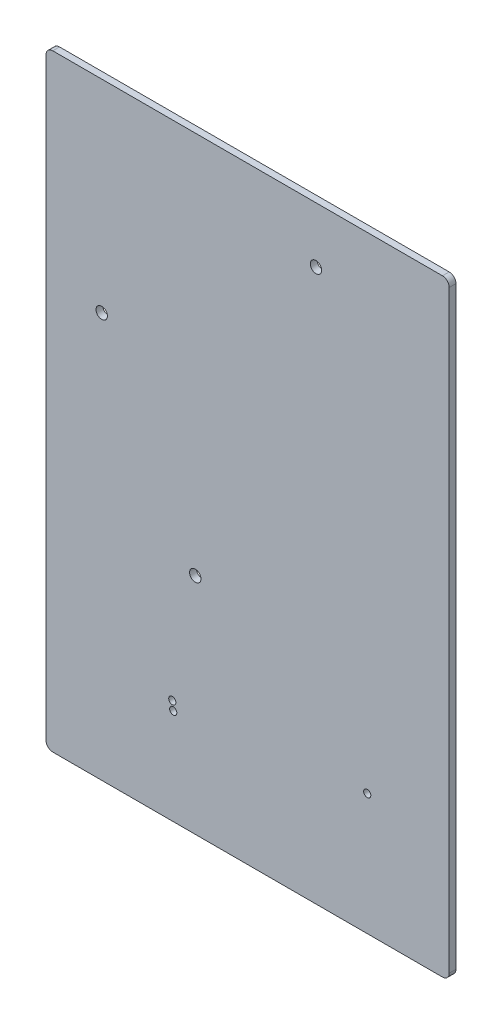
ISO-10303-21;
HEADER;
FILE_DESCRIPTION(('STEP AP214'),'2;1');
FILE_NAME('part.step','',(''),(''),'','','');
FILE_SCHEMA(('AUTOMOTIVE_DESIGN { 1 0 10303 214 1 1 1 1 }'));
ENDSEC;
DATA;
#1=APPLICATION_CONTEXT('core data for automotive mechanical design processes');
#2=APPLICATION_PROTOCOL_DEFINITION('international standard','automotive_design',2000,#1);
#3=PRODUCT_CONTEXT('',#1,'mechanical');
#4=PRODUCT('Part','Part','',(#3));
#5=PRODUCT_RELATED_PRODUCT_CATEGORY('part','',(#4));
#6=PRODUCT_DEFINITION_FORMATION('','',#4);
#7=PRODUCT_DEFINITION_CONTEXT('part definition',#1,'design');
#8=PRODUCT_DEFINITION('design','',#6,#7);
#9=PRODUCT_DEFINITION_SHAPE('','',#8);
#10=(LENGTH_UNIT() NAMED_UNIT(*) SI_UNIT(.MILLI.,.METRE.));
#11=(NAMED_UNIT(*) PLANE_ANGLE_UNIT() SI_UNIT($,.RADIAN.));
#12=(NAMED_UNIT(*) SI_UNIT($,.STERADIAN.) SOLID_ANGLE_UNIT());
#13=UNCERTAINTY_MEASURE_WITH_UNIT(LENGTH_MEASURE(1.E-05),#10,'distance_accuracy_value','');
#14=(GEOMETRIC_REPRESENTATION_CONTEXT(3) GLOBAL_UNCERTAINTY_ASSIGNED_CONTEXT((#13)) GLOBAL_UNIT_ASSIGNED_CONTEXT((#10,
#11,#12)) REPRESENTATION_CONTEXT('',''));
#15=CARTESIAN_POINT('',(0.,0.,0.));
#16=DIRECTION('',(0.,0.,1.));
#17=DIRECTION('',(1.,0.,0.));
#18=AXIS2_PLACEMENT_3D('',#15,#16,#17);
#19=CARTESIAN_POINT('',(0.,0.,6.35));
#20=DIRECTION('',(0.,1.,0.));
#21=DIRECTION('',(0.,0.,1.));
#22=AXIS2_PLACEMENT_3D('',#19,#20,#21);
#23=PLANE('',#22);
#24=DIRECTION('',(1.,0.,0.));
#25=VECTOR('',#24,1.);
#26=CARTESIAN_POINT('',(0.,0.,0.));
#27=LINE('',#26,#25);
#28=CARTESIAN_POINT('',(6.35,0.,0.));
#29=VERTEX_POINT('',#28);
#30=CARTESIAN_POINT('',(373.0625,0.,0.));
#31=VERTEX_POINT('',#30);
#32=EDGE_CURVE('E165',#29,#31,#27,.T.);
#33=ORIENTED_EDGE('',*,*,#32,.T.);
#34=DIRECTION('',(0.,0.,-1.));
#35=VECTOR('',#34,1.);
#36=CARTESIAN_POINT('',(373.0625,0.,6.35));
#37=LINE('',#36,#35);
#38=CARTESIAN_POINT('',(373.0625,0.,6.35));
#39=VERTEX_POINT('',#38);
#40=EDGE_CURVE('E139',#31,#39,#37,.F.);
#41=ORIENTED_EDGE('',*,*,#40,.T.);
#42=DIRECTION('',(1.,0.,0.));
#43=VECTOR('',#42,1.);
#44=CARTESIAN_POINT('',(0.,0.,6.35));
#45=LINE('',#44,#43);
#46=CARTESIAN_POINT('',(6.35,0.,6.35));
#47=VERTEX_POINT('',#46);
#48=EDGE_CURVE('E107',#47,#39,#45,.T.);
#49=ORIENTED_EDGE('',*,*,#48,.F.);
#50=DIRECTION('',(0.,0.,-1.));
#51=VECTOR('',#50,1.);
#52=CARTESIAN_POINT('',(6.35,0.,6.35));
#53=LINE('',#52,#51);
#54=EDGE_CURVE('E136',#47,#29,#53,.T.);
#55=ORIENTED_EDGE('',*,*,#54,.T.);
#56=EDGE_LOOP('',(#33,#41,#49,#55));
#57=FACE_BOUND('',#56,.T.);
#58=ADVANCED_FACE('F34',(#57),#23,.F.);
#59=CARTESIAN_POINT('',(379.4125,571.5,6.35));
#60=DIRECTION('',(-1.,0.,0.));
#61=DIRECTION('',(0.,0.,1.));
#62=AXIS2_PLACEMENT_3D('',#59,#60,#61);
#63=PLANE('',#62);
#64=DIRECTION('',(0.,1.,0.));
#65=VECTOR('',#64,1.);
#66=CARTESIAN_POINT('',(379.4125,0.,6.35));
#67=LINE('',#66,#65);
#68=CARTESIAN_POINT('',(379.4125,6.34999999999997,6.35));
#69=VERTEX_POINT('',#68);
#70=CARTESIAN_POINT('',(379.4125,565.15,6.35));
#71=VERTEX_POINT('',#70);
#72=EDGE_CURVE('E104',#69,#71,#67,.T.);
#73=ORIENTED_EDGE('',*,*,#72,.F.);
#74=DIRECTION('',(0.,0.,-1.));
#75=VECTOR('',#74,1.);
#76=CARTESIAN_POINT('',(379.4125,6.34999999999997,6.35));
#77=LINE('',#76,#75);
#78=CARTESIAN_POINT('',(379.4125,6.34999999999997,0.));
#79=VERTEX_POINT('',#78);
#80=EDGE_CURVE('E116',#69,#79,#77,.T.);
#81=ORIENTED_EDGE('',*,*,#80,.T.);
#82=DIRECTION('',(0.,1.,0.));
#83=VECTOR('',#82,1.);
#84=CARTESIAN_POINT('',(379.4125,0.,0.));
#85=LINE('',#84,#83);
#86=CARTESIAN_POINT('',(379.4125,565.15,0.));
#87=VERTEX_POINT('',#86);
#88=EDGE_CURVE('E163',#79,#87,#85,.T.);
#89=ORIENTED_EDGE('',*,*,#88,.T.);
#90=DIRECTION('',(0.,0.,-1.));
#91=VECTOR('',#90,1.);
#92=CARTESIAN_POINT('',(379.4125,565.15,6.35));
#93=LINE('',#92,#91);
#94=EDGE_CURVE('E119',#87,#71,#93,.F.);
#95=ORIENTED_EDGE('',*,*,#94,.T.);
#96=EDGE_LOOP('',(#73,#81,#89,#95));
#97=FACE_BOUND('',#96,.T.);
#98=ADVANCED_FACE('F114',(#97),#63,.F.);
#99=CARTESIAN_POINT('',(379.4125,571.5,6.35));
#100=DIRECTION('',(0.,-1.,0.));
#101=DIRECTION('',(0.,0.,-1.));
#102=AXIS2_PLACEMENT_3D('',#99,#100,#101);
#103=PLANE('',#102);
#104=DIRECTION('',(-1.,0.,0.));
#105=VECTOR('',#104,1.);
#106=CARTESIAN_POINT('',(379.4125,571.5,0.));
#107=LINE('',#106,#105);
#108=CARTESIAN_POINT('',(373.0625,571.5,0.));
#109=VERTEX_POINT('',#108);
#110=CARTESIAN_POINT('',(6.35000000000002,571.5,0.));
#111=VERTEX_POINT('',#110);
#112=EDGE_CURVE('E156',#109,#111,#107,.T.);
#113=ORIENTED_EDGE('',*,*,#112,.T.);
#114=DIRECTION('',(0.,0.,-1.));
#115=VECTOR('',#114,1.);
#116=CARTESIAN_POINT('',(6.35000000000002,571.5,6.35));
#117=LINE('',#116,#115);
#118=CARTESIAN_POINT('',(6.35000000000002,571.5,6.35));
#119=VERTEX_POINT('',#118);
#120=EDGE_CURVE('E11',#111,#119,#117,.F.);
#121=ORIENTED_EDGE('',*,*,#120,.T.);
#122=DIRECTION('',(-1.,0.,0.));
#123=VECTOR('',#122,1.);
#124=CARTESIAN_POINT('',(379.4125,571.5,6.35));
#125=LINE('',#124,#123);
#126=CARTESIAN_POINT('',(373.0625,571.5,6.35));
#127=VERTEX_POINT('',#126);
#128=EDGE_CURVE('E120',#127,#119,#125,.T.);
#129=ORIENTED_EDGE('',*,*,#128,.F.);
#130=DIRECTION('',(0.,0.,-1.));
#131=VECTOR('',#130,1.);
#132=CARTESIAN_POINT('',(373.0625,571.5,6.35));
#133=LINE('',#132,#131);
#134=EDGE_CURVE('E42',#127,#109,#133,.T.);
#135=ORIENTED_EDGE('',*,*,#134,.T.);
#136=EDGE_LOOP('',(#113,#121,#129,#135));
#137=FACE_BOUND('',#136,.T.);
#138=ADVANCED_FACE('F155',(#137),#103,.F.);
#139=CARTESIAN_POINT('',(0.,0.,6.35));
#140=DIRECTION('',(1.,0.,0.));
#141=DIRECTION('',(0.,0.,-1.));
#142=AXIS2_PLACEMENT_3D('',#139,#140,#141);
#143=PLANE('',#142);
#144=DIRECTION('',(0.,-1.,0.));
#145=VECTOR('',#144,1.);
#146=CARTESIAN_POINT('',(0.,0.,6.35));
#147=LINE('',#146,#145);
#148=CARTESIAN_POINT('',(0.,565.15,6.35));
#149=VERTEX_POINT('',#148);
#150=CARTESIAN_POINT('',(0.,6.35,6.35));
#151=VERTEX_POINT('',#150);
#152=EDGE_CURVE('E128',#149,#151,#147,.T.);
#153=ORIENTED_EDGE('',*,*,#152,.F.);
#154=DIRECTION('',(0.,0.,-1.));
#155=VECTOR('',#154,1.);
#156=CARTESIAN_POINT('',(0.,565.15,6.35));
#157=LINE('',#156,#155);
#158=CARTESIAN_POINT('',(0.,565.15,0.));
#159=VERTEX_POINT('',#158);
#160=EDGE_CURVE('E147',#149,#159,#157,.T.);
#161=ORIENTED_EDGE('',*,*,#160,.T.);
#162=DIRECTION('',(0.,-1.,0.));
#163=VECTOR('',#162,1.);
#164=CARTESIAN_POINT('',(0.,0.,0.));
#165=LINE('',#164,#163);
#166=CARTESIAN_POINT('',(0.,6.35,0.));
#167=VERTEX_POINT('',#166);
#168=EDGE_CURVE('E162',#159,#167,#165,.T.);
#169=ORIENTED_EDGE('',*,*,#168,.T.);
#170=DIRECTION('',(0.,0.,-1.));
#171=VECTOR('',#170,1.);
#172=CARTESIAN_POINT('',(0.,6.35,6.35));
#173=LINE('',#172,#171);
#174=EDGE_CURVE('E49',#167,#151,#173,.F.);
#175=ORIENTED_EDGE('',*,*,#174,.T.);
#176=EDGE_LOOP('',(#153,#161,#169,#175));
#177=FACE_BOUND('',#176,.T.);
#178=ADVANCED_FACE('F259',(#177),#143,.F.);
#179=CARTESIAN_POINT('',(0.,0.,6.35));
#180=DIRECTION('',(0.,0.,1.));
#181=DIRECTION('',(1.,0.,0.));
#182=AXIS2_PLACEMENT_3D('',#179,#180,#181);
#183=PLANE('',#182);
#184=CARTESIAN_POINT('',(254.,519.1125,6.35));
#185=DIRECTION('',(0.,0.,-1.));
#186=DIRECTION('',(-1.,0.,0.));
#187=AXIS2_PLACEMENT_3D('',#184,#185,#186);
#188=CIRCLE('',#187,5.35787599999998);
#189=CARTESIAN_POINT('',(248.642124,519.1125,6.35));
#190=VERTEX_POINT('',#189);
#191=EDGE_CURVE('E203',#190,#190,#188,.T.);
#192=ORIENTED_EDGE('',*,*,#191,.T.);
#193=EDGE_LOOP('',(#192));
#194=FACE_BOUND('',#193,.T.);
#195=CARTESIAN_POINT('',(52.3875,381.,6.35));
#196=DIRECTION('',(0.,0.,-1.));
#197=DIRECTION('',(-1.,0.,0.));
#198=AXIS2_PLACEMENT_3D('',#195,#196,#197);
#199=CIRCLE('',#198,5.357876);
#200=CARTESIAN_POINT('',(47.029624,381.,6.35));
#201=VERTEX_POINT('',#200);
#202=EDGE_CURVE('E197',#201,#201,#199,.T.);
#203=ORIENTED_EDGE('',*,*,#202,.T.);
#204=EDGE_LOOP('',(#203));
#205=FACE_BOUND('',#204,.T.);
#206=CARTESIAN_POINT('',(140.462,210.82,6.35));
#207=DIRECTION('',(0.,0.,-1.));
#208=DIRECTION('',(-1.,0.,0.));
#209=AXIS2_PLACEMENT_3D('',#206,#207,#208);
#210=CIRCLE('',#209,5.35787600000001);
#211=CARTESIAN_POINT('',(135.104124,210.82,6.35));
#212=VERTEX_POINT('',#211);
#213=EDGE_CURVE('E191',#212,#212,#210,.T.);
#214=ORIENTED_EDGE('',*,*,#213,.T.);
#215=EDGE_LOOP('',(#214));
#216=FACE_BOUND('',#215,.T.);
#217=ORIENTED_EDGE('',*,*,#48,.T.);
#218=CARTESIAN_POINT('',(373.0625,6.34999999999997,6.35));
#219=DIRECTION('',(0.,0.,1.));
#220=DIRECTION('',(1.,0.,0.));
#221=AXIS2_PLACEMENT_3D('',#218,#219,#220);
#222=CIRCLE('',#221,6.35);
#223=EDGE_CURVE('E100',#39,#69,#222,.T.);
#224=ORIENTED_EDGE('',*,*,#223,.T.);
#225=ORIENTED_EDGE('',*,*,#72,.T.);
#226=CARTESIAN_POINT('',(373.0625,565.15,6.35));
#227=DIRECTION('',(0.,0.,1.));
#228=DIRECTION('',(1.,0.,0.));
#229=AXIS2_PLACEMENT_3D('',#226,#227,#228);
#230=CIRCLE('',#229,6.35);
#231=EDGE_CURVE('E143',#71,#127,#230,.T.);
#232=ORIENTED_EDGE('',*,*,#231,.T.);
#233=ORIENTED_EDGE('',*,*,#128,.T.);
#234=CARTESIAN_POINT('',(6.35,565.15,6.35));
#235=DIRECTION('',(0.,0.,1.));
#236=DIRECTION('',(1.,0.,0.));
#237=AXIS2_PLACEMENT_3D('',#234,#235,#236);
#238=CIRCLE('',#237,6.35);
#239=EDGE_CURVE('E56',#119,#149,#238,.T.);
#240=ORIENTED_EDGE('',*,*,#239,.T.);
#241=ORIENTED_EDGE('',*,*,#152,.T.);
#242=CARTESIAN_POINT('',(6.35,6.35,6.35));
#243=DIRECTION('',(0.,0.,1.));
#244=DIRECTION('',(1.,0.,0.));
#245=AXIS2_PLACEMENT_3D('',#242,#243,#244);
#246=CIRCLE('',#245,6.35);
#247=EDGE_CURVE('E141',#151,#47,#246,.T.);
#248=ORIENTED_EDGE('',*,*,#247,.T.);
#249=EDGE_LOOP('',(#217,#224,#225,#232,#233,#240,#241,#248));
#250=FACE_BOUND('',#249,.T.);
#251=CARTESIAN_POINT('',(118.810746346405,98.25026997302,6.35));
#252=DIRECTION('',(0.,0.,-1.));
#253=DIRECTION('',(-1.,0.,0.));
#254=AXIS2_PLACEMENT_3D('',#251,#252,#253);
#255=CIRCLE('',#254,3.3782);
#256=CARTESIAN_POINT('',(115.432546346405,98.25026997302,6.35));
#257=VERTEX_POINT('',#256);
#258=EDGE_CURVE('E185',#257,#257,#255,.T.);
#259=ORIENTED_EDGE('',*,*,#258,.T.);
#260=EDGE_LOOP('',(#259));
#261=FACE_BOUND('',#260,.T.);
#262=CARTESIAN_POINT('',(302.26,114.3,6.35));
#263=DIRECTION('',(0.,0.,-1.));
#264=DIRECTION('',(-1.,0.,0.));
#265=AXIS2_PLACEMENT_3D('',#262,#263,#264);
#266=CIRCLE('',#265,3.3782);
#267=CARTESIAN_POINT('',(298.8818,114.3,6.35));
#268=VERTEX_POINT('',#267);
#269=EDGE_CURVE('E179',#268,#268,#266,.T.);
#270=ORIENTED_EDGE('',*,*,#269,.T.);
#271=EDGE_LOOP('',(#270));
#272=FACE_BOUND('',#271,.T.);
#273=CARTESIAN_POINT('',(119.685428778013,90.2636017026774,6.35));
#274=DIRECTION('',(0.,0.,-1.));
#275=DIRECTION('',(-1.,0.,0.));
#276=AXIS2_PLACEMENT_3D('',#273,#274,#275);
#277=CIRCLE('',#276,3.3782);
#278=CARTESIAN_POINT('',(116.307228778013,90.2636017026774,6.35));
#279=VERTEX_POINT('',#278);
#280=EDGE_CURVE('E170',#279,#279,#277,.T.);
#281=ORIENTED_EDGE('',*,*,#280,.T.);
#282=EDGE_LOOP('',(#281));
#283=FACE_BOUND('',#282,.T.);
#284=ADVANCED_FACE('F102',(#194,#205,#216,#250,#261,#272,#283),#183,.T.);
#285=CARTESIAN_POINT('',(0.,0.,0.));
#286=DIRECTION('',(0.,0.,1.));
#287=DIRECTION('',(1.,0.,0.));
#288=AXIS2_PLACEMENT_3D('',#285,#286,#287);
#289=PLANE('',#288);
#290=CARTESIAN_POINT('',(254.,519.1125,0.));
#291=DIRECTION('',(0.,0.,-1.));
#292=DIRECTION('',(-1.,0.,0.));
#293=AXIS2_PLACEMENT_3D('',#290,#291,#292);
#294=CIRCLE('',#293,5.35787599999998);
#295=CARTESIAN_POINT('',(248.642124,519.1125,0.));
#296=VERTEX_POINT('',#295);
#297=EDGE_CURVE('E206',#296,#296,#294,.T.);
#298=ORIENTED_EDGE('',*,*,#297,.F.);
#299=EDGE_LOOP('',(#298));
#300=FACE_BOUND('',#299,.T.);
#301=CARTESIAN_POINT('',(52.3875,381.,0.));
#302=DIRECTION('',(0.,0.,-1.));
#303=DIRECTION('',(-1.,0.,0.));
#304=AXIS2_PLACEMENT_3D('',#301,#302,#303);
#305=CIRCLE('',#304,5.357876);
#306=CARTESIAN_POINT('',(47.029624,381.,0.));
#307=VERTEX_POINT('',#306);
#308=EDGE_CURVE('E200',#307,#307,#305,.T.);
#309=ORIENTED_EDGE('',*,*,#308,.F.);
#310=EDGE_LOOP('',(#309));
#311=FACE_BOUND('',#310,.T.);
#312=CARTESIAN_POINT('',(140.462,210.82,0.));
#313=DIRECTION('',(0.,0.,-1.));
#314=DIRECTION('',(-1.,0.,0.));
#315=AXIS2_PLACEMENT_3D('',#312,#313,#314);
#316=CIRCLE('',#315,5.35787600000001);
#317=CARTESIAN_POINT('',(135.104124,210.82,0.));
#318=VERTEX_POINT('',#317);
#319=EDGE_CURVE('E194',#318,#318,#316,.T.);
#320=ORIENTED_EDGE('',*,*,#319,.F.);
#321=EDGE_LOOP('',(#320));
#322=FACE_BOUND('',#321,.T.);
#323=CARTESIAN_POINT('',(118.810746346405,98.25026997302,0.));
#324=DIRECTION('',(0.,0.,-1.));
#325=DIRECTION('',(-1.,0.,0.));
#326=AXIS2_PLACEMENT_3D('',#323,#324,#325);
#327=CIRCLE('',#326,3.37819999999998);
#328=CARTESIAN_POINT('',(115.432546346405,98.25026997302,0.));
#329=VERTEX_POINT('',#328);
#330=EDGE_CURVE('E188',#329,#329,#327,.T.);
#331=ORIENTED_EDGE('',*,*,#330,.F.);
#332=EDGE_LOOP('',(#331));
#333=FACE_BOUND('',#332,.T.);
#334=CARTESIAN_POINT('',(302.26,114.3,0.));
#335=DIRECTION('',(0.,0.,-1.));
#336=DIRECTION('',(-1.,0.,0.));
#337=AXIS2_PLACEMENT_3D('',#334,#335,#336);
#338=CIRCLE('',#337,3.3782);
#339=CARTESIAN_POINT('',(298.8818,114.3,0.));
#340=VERTEX_POINT('',#339);
#341=EDGE_CURVE('E182',#340,#340,#338,.T.);
#342=ORIENTED_EDGE('',*,*,#341,.F.);
#343=EDGE_LOOP('',(#342));
#344=FACE_BOUND('',#343,.T.);
#345=CARTESIAN_POINT('',(119.685428778013,90.2636017026774,0.));
#346=DIRECTION('',(0.,0.,-1.));
#347=DIRECTION('',(-1.,0.,0.));
#348=AXIS2_PLACEMENT_3D('',#345,#346,#347);
#349=CIRCLE('',#348,3.37819999999998);
#350=CARTESIAN_POINT('',(116.307228778013,90.2636017026774,0.));
#351=VERTEX_POINT('',#350);
#352=EDGE_CURVE('E176',#351,#351,#349,.T.);
#353=ORIENTED_EDGE('',*,*,#352,.F.);
#354=EDGE_LOOP('',(#353));
#355=FACE_BOUND('',#354,.T.);
#356=ORIENTED_EDGE('',*,*,#88,.F.);
#357=CARTESIAN_POINT('',(373.0625,6.34999999999997,0.));
#358=DIRECTION('',(0.,0.,1.));
#359=DIRECTION('',(1.,0.,0.));
#360=AXIS2_PLACEMENT_3D('',#357,#358,#359);
#361=CIRCLE('',#360,6.35);
#362=EDGE_CURVE('E123',#79,#31,#361,.F.);
#363=ORIENTED_EDGE('',*,*,#362,.T.);
#364=ORIENTED_EDGE('',*,*,#32,.F.);
#365=CARTESIAN_POINT('',(6.35,6.35,0.));
#366=DIRECTION('',(0.,0.,1.));
#367=DIRECTION('',(1.,0.,0.));
#368=AXIS2_PLACEMENT_3D('',#365,#366,#367);
#369=CIRCLE('',#368,6.35);
#370=EDGE_CURVE('E124',#29,#167,#369,.F.);
#371=ORIENTED_EDGE('',*,*,#370,.T.);
#372=ORIENTED_EDGE('',*,*,#168,.F.);
#373=CARTESIAN_POINT('',(6.35,565.15,0.));
#374=DIRECTION('',(0.,0.,1.));
#375=DIRECTION('',(1.,0.,0.));
#376=AXIS2_PLACEMENT_3D('',#373,#374,#375);
#377=CIRCLE('',#376,6.35);
#378=EDGE_CURVE('E133',#159,#111,#377,.F.);
#379=ORIENTED_EDGE('',*,*,#378,.T.);
#380=ORIENTED_EDGE('',*,*,#112,.F.);
#381=CARTESIAN_POINT('',(373.0625,565.15,0.));
#382=DIRECTION('',(0.,0.,1.));
#383=DIRECTION('',(1.,0.,0.));
#384=AXIS2_PLACEMENT_3D('',#381,#382,#383);
#385=CIRCLE('',#384,6.35);
#386=EDGE_CURVE('E126',#109,#87,#385,.F.);
#387=ORIENTED_EDGE('',*,*,#386,.T.);
#388=EDGE_LOOP('',(#356,#363,#364,#371,#372,#379,#380,#387));
#389=FACE_BOUND('',#388,.T.);
#390=ADVANCED_FACE('F160',(#300,#311,#322,#333,#344,#355,#389),#289,.F.);
#391=CARTESIAN_POINT('',(119.685428778013,90.2636017026774,0.));
#392=DIRECTION('',(0.,0.,-1.));
#393=DIRECTION('',(-1.,0.,0.));
#394=AXIS2_PLACEMENT_3D('',#391,#392,#393);
#395=CYLINDRICAL_SURFACE('',#394,3.37819999999999);
#396=ORIENTED_EDGE('',*,*,#280,.F.);
#397=EDGE_LOOP('',(#396));
#398=FACE_BOUND('',#397,.T.);
#399=ORIENTED_EDGE('',*,*,#352,.T.);
#400=EDGE_LOOP('',(#399));
#401=FACE_BOUND('',#400,.T.);
#402=ADVANCED_FACE('F214',(#398,#401),#395,.F.);
#403=CARTESIAN_POINT('',(302.26,114.3,0.));
#404=DIRECTION('',(0.,0.,-1.));
#405=DIRECTION('',(-1.,0.,0.));
#406=AXIS2_PLACEMENT_3D('',#403,#404,#405);
#407=CYLINDRICAL_SURFACE('',#406,3.3782);
#408=ORIENTED_EDGE('',*,*,#269,.F.);
#409=EDGE_LOOP('',(#408));
#410=FACE_BOUND('',#409,.T.);
#411=ORIENTED_EDGE('',*,*,#341,.T.);
#412=EDGE_LOOP('',(#411));
#413=FACE_BOUND('',#412,.T.);
#414=ADVANCED_FACE('F227',(#410,#413),#407,.F.);
#415=CARTESIAN_POINT('',(118.810746346405,98.25026997302,0.));
#416=DIRECTION('',(0.,0.,-1.));
#417=DIRECTION('',(-1.,0.,0.));
#418=AXIS2_PLACEMENT_3D('',#415,#416,#417);
#419=CYLINDRICAL_SURFACE('',#418,3.37819999999999);
#420=ORIENTED_EDGE('',*,*,#258,.F.);
#421=EDGE_LOOP('',(#420));
#422=FACE_BOUND('',#421,.T.);
#423=ORIENTED_EDGE('',*,*,#330,.T.);
#424=EDGE_LOOP('',(#423));
#425=FACE_BOUND('',#424,.T.);
#426=ADVANCED_FACE('F233',(#422,#425),#419,.F.);
#427=CARTESIAN_POINT('',(140.462,210.82,0.));
#428=DIRECTION('',(0.,0.,-1.));
#429=DIRECTION('',(-1.,0.,0.));
#430=AXIS2_PLACEMENT_3D('',#427,#428,#429);
#431=CYLINDRICAL_SURFACE('',#430,5.35787600000001);
#432=ORIENTED_EDGE('',*,*,#213,.F.);
#433=EDGE_LOOP('',(#432));
#434=FACE_BOUND('',#433,.T.);
#435=ORIENTED_EDGE('',*,*,#319,.T.);
#436=EDGE_LOOP('',(#435));
#437=FACE_BOUND('',#436,.T.);
#438=ADVANCED_FACE('F303',(#434,#437),#431,.F.);
#439=CARTESIAN_POINT('',(52.3875,381.,0.));
#440=DIRECTION('',(0.,0.,-1.));
#441=DIRECTION('',(-1.,0.,0.));
#442=AXIS2_PLACEMENT_3D('',#439,#440,#441);
#443=CYLINDRICAL_SURFACE('',#442,5.357876);
#444=ORIENTED_EDGE('',*,*,#202,.F.);
#445=EDGE_LOOP('',(#444));
#446=FACE_BOUND('',#445,.T.);
#447=ORIENTED_EDGE('',*,*,#308,.T.);
#448=EDGE_LOOP('',(#447));
#449=FACE_BOUND('',#448,.T.);
#450=ADVANCED_FACE('F292',(#446,#449),#443,.F.);
#451=CARTESIAN_POINT('',(254.,519.1125,0.));
#452=DIRECTION('',(0.,0.,-1.));
#453=DIRECTION('',(-1.,0.,0.));
#454=AXIS2_PLACEMENT_3D('',#451,#452,#453);
#455=CYLINDRICAL_SURFACE('',#454,5.35787599999998);
#456=ORIENTED_EDGE('',*,*,#191,.F.);
#457=EDGE_LOOP('',(#456));
#458=FACE_BOUND('',#457,.T.);
#459=ORIENTED_EDGE('',*,*,#297,.T.);
#460=EDGE_LOOP('',(#459));
#461=FACE_BOUND('',#460,.T.);
#462=ADVANCED_FACE('F210',(#458,#461),#455,.F.);
#463=CARTESIAN_POINT('',(373.0625,6.34999999999997,6.35));
#464=DIRECTION('',(0.,0.,-1.));
#465=DIRECTION('',(-1.,0.,0.));
#466=AXIS2_PLACEMENT_3D('',#463,#464,#465);
#467=CYLINDRICAL_SURFACE('',#466,6.35);
#468=ORIENTED_EDGE('',*,*,#223,.F.);
#469=ORIENTED_EDGE('',*,*,#40,.F.);
#470=ORIENTED_EDGE('',*,*,#362,.F.);
#471=ORIENTED_EDGE('',*,*,#80,.F.);
#472=EDGE_LOOP('',(#468,#469,#470,#471));
#473=FACE_BOUND('',#472,.T.);
#474=ADVANCED_FACE('F122',(#473),#467,.T.);
#475=CARTESIAN_POINT('',(6.35,565.15,6.35));
#476=DIRECTION('',(0.,0.,-1.));
#477=DIRECTION('',(-1.,0.,0.));
#478=AXIS2_PLACEMENT_3D('',#475,#476,#477);
#479=CYLINDRICAL_SURFACE('',#478,6.35);
#480=ORIENTED_EDGE('',*,*,#239,.F.);
#481=ORIENTED_EDGE('',*,*,#120,.F.);
#482=ORIENTED_EDGE('',*,*,#378,.F.);
#483=ORIENTED_EDGE('',*,*,#160,.F.);
#484=EDGE_LOOP('',(#480,#481,#482,#483));
#485=FACE_BOUND('',#484,.T.);
#486=ADVANCED_FACE('F249',(#485),#479,.T.);
#487=CARTESIAN_POINT('',(373.0625,565.15,6.35));
#488=DIRECTION('',(0.,0.,-1.));
#489=DIRECTION('',(-1.,0.,0.));
#490=AXIS2_PLACEMENT_3D('',#487,#488,#489);
#491=CYLINDRICAL_SURFACE('',#490,6.35);
#492=ORIENTED_EDGE('',*,*,#231,.F.);
#493=ORIENTED_EDGE('',*,*,#94,.F.);
#494=ORIENTED_EDGE('',*,*,#386,.F.);
#495=ORIENTED_EDGE('',*,*,#134,.F.);
#496=EDGE_LOOP('',(#492,#493,#494,#495));
#497=FACE_BOUND('',#496,.T.);
#498=ADVANCED_FACE('F251',(#497),#491,.T.);
#499=CARTESIAN_POINT('',(6.35,6.35,6.35));
#500=DIRECTION('',(0.,0.,-1.));
#501=DIRECTION('',(-1.,0.,0.));
#502=AXIS2_PLACEMENT_3D('',#499,#500,#501);
#503=CYLINDRICAL_SURFACE('',#502,6.35);
#504=ORIENTED_EDGE('',*,*,#247,.F.);
#505=ORIENTED_EDGE('',*,*,#174,.F.);
#506=ORIENTED_EDGE('',*,*,#370,.F.);
#507=ORIENTED_EDGE('',*,*,#54,.F.);
#508=EDGE_LOOP('',(#504,#505,#506,#507));
#509=FACE_BOUND('',#508,.T.);
#510=ADVANCED_FACE('F36',(#509),#503,.T.);
#511=CLOSED_SHELL('',(#58,#98,#138,#178,#284,#390,#402,#414,#426,#438,#450,#462,#474,#486,#498,#510));
#512=MANIFOLD_SOLID_BREP('B2',#511);
#513=ADVANCED_BREP_SHAPE_REPRESENTATION('',(#18,#512),#14);
#514=SHAPE_DEFINITION_REPRESENTATION(#9,#513);
ENDSEC;
END-ISO-10303-21;
